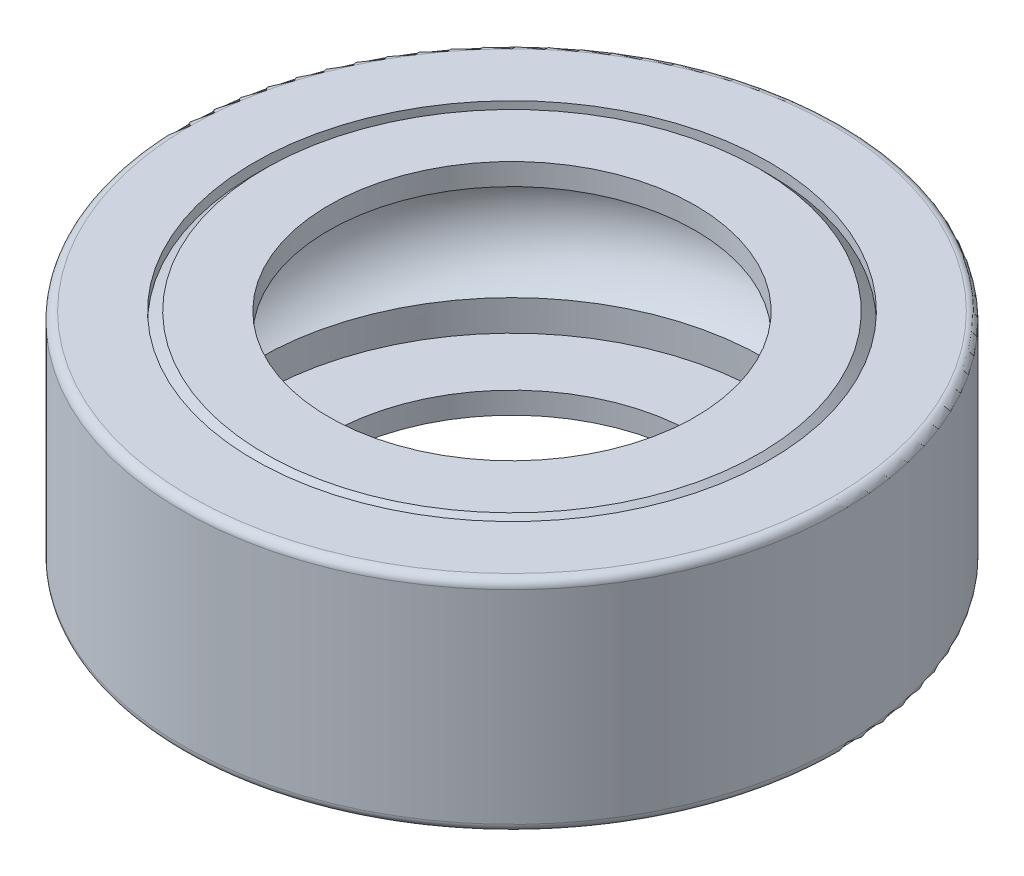
ISO-10303-21;
HEADER;
FILE_DESCRIPTION(('STEP AP214'),'2;1');
FILE_NAME('part.step','',(''),(''),'','','');
FILE_SCHEMA(('AUTOMOTIVE_DESIGN { 1 0 10303 214 1 1 1 1 }'));
ENDSEC;
DATA;
#1=APPLICATION_CONTEXT('core data for automotive mechanical design processes');
#2=APPLICATION_PROTOCOL_DEFINITION('international standard','automotive_design',2000,#1);
#3=PRODUCT_CONTEXT('',#1,'mechanical');
#4=PRODUCT('Part','Part','',(#3));
#5=PRODUCT_RELATED_PRODUCT_CATEGORY('part','',(#4));
#6=PRODUCT_DEFINITION_FORMATION('','',#4);
#7=PRODUCT_DEFINITION_CONTEXT('part definition',#1,'design');
#8=PRODUCT_DEFINITION('design','',#6,#7);
#9=PRODUCT_DEFINITION_SHAPE('','',#8);
#10=(LENGTH_UNIT() NAMED_UNIT(*) SI_UNIT(.MILLI.,.METRE.));
#11=(NAMED_UNIT(*) PLANE_ANGLE_UNIT() SI_UNIT($,.RADIAN.));
#12=(NAMED_UNIT(*) SI_UNIT($,.STERADIAN.) SOLID_ANGLE_UNIT());
#13=UNCERTAINTY_MEASURE_WITH_UNIT(LENGTH_MEASURE(1.E-05),#10,'distance_accuracy_value','');
#14=(GEOMETRIC_REPRESENTATION_CONTEXT(3) GLOBAL_UNCERTAINTY_ASSIGNED_CONTEXT((#13)) GLOBAL_UNIT_ASSIGNED_CONTEXT((#10,
#11,#12)) REPRESENTATION_CONTEXT('',''));
#15=CARTESIAN_POINT('',(0.,0.,0.));
#16=DIRECTION('',(0.,0.,1.));
#17=DIRECTION('',(1.,0.,0.));
#18=AXIS2_PLACEMENT_3D('',#15,#16,#17);
#19=CARTESIAN_POINT('',(0.,-4.,0.));
#20=DIRECTION('',(0.,1.,0.));
#21=DIRECTION('',(0.,0.,1.));
#22=AXIS2_PLACEMENT_3D('',#19,#20,#21);
#23=CYLINDRICAL_SURFACE('',#22,12.);
#24=CARTESIAN_POINT('',(0.,-7.7,0.));
#25=DIRECTION('',(0.,1.,0.));
#26=DIRECTION('',(0.,0.,1.));
#27=AXIS2_PLACEMENT_3D('',#24,#25,#26);
#28=CIRCLE('',#27,12.);
#29=CARTESIAN_POINT('',(0.,-7.7,-12.));
#30=VERTEX_POINT('',#29);
#31=EDGE_CURVE('E10',#30,#30,#28,.T.);
#32=ORIENTED_EDGE('',*,*,#31,.T.);
#33=EDGE_LOOP('',(#32));
#34=FACE_BOUND('',#33,.T.);
#35=CARTESIAN_POINT('',(0.,-0.3,0.));
#36=DIRECTION('',(0.,1.,0.));
#37=DIRECTION('',(0.,0.,1.));
#38=AXIS2_PLACEMENT_3D('',#35,#36,#37);
#39=CIRCLE('',#38,12.);
#40=CARTESIAN_POINT('',(0.,-0.3,-12.));
#41=VERTEX_POINT('',#40);
#42=EDGE_CURVE('E47',#41,#41,#39,.T.);
#43=ORIENTED_EDGE('',*,*,#42,.F.);
#44=EDGE_LOOP('',(#43));
#45=FACE_BOUND('',#44,.T.);
#46=ADVANCED_FACE('F16',(#34,#45),#23,.T.);
#47=CARTESIAN_POINT('',(0.,-7.7,0.));
#48=DIRECTION('',(0.,1.,0.));
#49=DIRECTION('',(0.,0.,1.));
#50=AXIS2_PLACEMENT_3D('',#47,#48,#49);
#51=TOROIDAL_SURFACE('',#50,11.7,0.3);
#52=CARTESIAN_POINT('',(0.,-8.,0.));
#53=DIRECTION('',(0.,1.,0.));
#54=DIRECTION('',(0.,0.,1.));
#55=AXIS2_PLACEMENT_3D('',#52,#53,#54);
#56=CIRCLE('',#55,11.7);
#57=CARTESIAN_POINT('',(0.,-8.,-11.7));
#58=VERTEX_POINT('',#57);
#59=EDGE_CURVE('E26',#58,#58,#56,.T.);
#60=ORIENTED_EDGE('',*,*,#59,.T.);
#61=EDGE_LOOP('',(#60));
#62=FACE_BOUND('',#61,.T.);
#63=ORIENTED_EDGE('',*,*,#31,.F.);
#64=EDGE_LOOP('',(#63));
#65=FACE_BOUND('',#64,.T.);
#66=ADVANCED_FACE('F233',(#62,#65),#51,.T.);
#67=CARTESIAN_POINT('',(0.,-0.3,0.));
#68=DIRECTION('',(0.,1.,0.));
#69=DIRECTION('',(0.,0.,1.));
#70=AXIS2_PLACEMENT_3D('',#67,#68,#69);
#71=TOROIDAL_SURFACE('',#70,11.7,0.3);
#72=ORIENTED_EDGE('',*,*,#42,.T.);
#73=EDGE_LOOP('',(#72));
#74=FACE_BOUND('',#73,.T.);
#75=CARTESIAN_POINT('',(0.,0.,0.));
#76=DIRECTION('',(0.,1.,0.));
#77=DIRECTION('',(0.,0.,1.));
#78=AXIS2_PLACEMENT_3D('',#75,#76,#77);
#79=CIRCLE('',#78,11.7);
#80=CARTESIAN_POINT('',(0.,0.,-11.7));
#81=VERTEX_POINT('',#80);
#82=EDGE_CURVE('E148',#81,#81,#79,.T.);
#83=ORIENTED_EDGE('',*,*,#82,.F.);
#84=EDGE_LOOP('',(#83));
#85=FACE_BOUND('',#84,.T.);
#86=ADVANCED_FACE('F239',(#74,#85),#71,.T.);
#87=CARTESIAN_POINT('',(0.,-8.,10.542));
#88=DIRECTION('',(0.,-1.,0.));
#89=DIRECTION('',(-1.,0.,0.));
#90=AXIS2_PLACEMENT_3D('',#87,#88,#89);
#91=PLANE('',#90);
#92=ORIENTED_EDGE('',*,*,#59,.F.);
#93=EDGE_LOOP('',(#92));
#94=FACE_BOUND('',#93,.T.);
#95=CARTESIAN_POINT('',(0.,-8.,0.));
#96=DIRECTION('',(0.,1.,0.));
#97=DIRECTION('',(0.,0.,1.));
#98=AXIS2_PLACEMENT_3D('',#95,#96,#97);
#99=CIRCLE('',#98,9.384);
#100=CARTESIAN_POINT('',(0.,-8.,-9.384));
#101=VERTEX_POINT('',#100);
#102=EDGE_CURVE('E152',#101,#101,#99,.T.);
#103=ORIENTED_EDGE('',*,*,#102,.T.);
#104=EDGE_LOOP('',(#103));
#105=FACE_BOUND('',#104,.T.);
#106=ADVANCED_FACE('F248',(#94,#105),#91,.T.);
#107=CARTESIAN_POINT('',(0.,0.,10.542));
#108=DIRECTION('',(0.,1.,0.));
#109=DIRECTION('',(1.,0.,0.));
#110=AXIS2_PLACEMENT_3D('',#107,#108,#109);
#111=PLANE('',#110);
#112=CARTESIAN_POINT('',(0.,0.,0.));
#113=DIRECTION('',(0.,1.,0.));
#114=DIRECTION('',(0.,0.,1.));
#115=AXIS2_PLACEMENT_3D('',#112,#113,#114);
#116=CIRCLE('',#115,9.384);
#117=CARTESIAN_POINT('',(0.,0.,-9.384));
#118=VERTEX_POINT('',#117);
#119=EDGE_CURVE('E153',#118,#118,#116,.T.);
#120=ORIENTED_EDGE('',*,*,#119,.F.);
#121=EDGE_LOOP('',(#120));
#122=FACE_BOUND('',#121,.T.);
#123=ORIENTED_EDGE('',*,*,#82,.T.);
#124=EDGE_LOOP('',(#123));
#125=FACE_BOUND('',#124,.T.);
#126=ADVANCED_FACE('F251',(#122,#125),#111,.T.);
#127=CARTESIAN_POINT('',(0.,-7.6,0.));
#128=DIRECTION('',(0.,1.,0.));
#129=DIRECTION('',(0.,0.,1.));
#130=AXIS2_PLACEMENT_3D('',#127,#128,#129);
#131=CYLINDRICAL_SURFACE('',#130,9.384);
#132=ORIENTED_EDGE('',*,*,#102,.F.);
#133=EDGE_LOOP('',(#132));
#134=FACE_BOUND('',#133,.T.);
#135=CARTESIAN_POINT('',(0.,-7.61,0.));
#136=DIRECTION('',(0.,-1.,0.));
#137=DIRECTION('',(0.,0.,1.));
#138=AXIS2_PLACEMENT_3D('',#135,#136,#137);
#139=CIRCLE('',#138,9.384);
#140=CARTESIAN_POINT('',(0.,-7.61,-9.384));
#141=VERTEX_POINT('',#140);
#142=EDGE_CURVE('E173',#141,#141,#139,.T.);
#143=ORIENTED_EDGE('',*,*,#142,.F.);
#144=EDGE_LOOP('',(#143));
#145=FACE_BOUND('',#144,.T.);
#146=ADVANCED_FACE('F255',(#134,#145),#131,.F.);
#147=CARTESIAN_POINT('',(0.,-0.4,0.));
#148=DIRECTION('',(0.,1.,0.));
#149=DIRECTION('',(0.,0.,1.));
#150=AXIS2_PLACEMENT_3D('',#147,#148,#149);
#151=CYLINDRICAL_SURFACE('',#150,9.384);
#152=ORIENTED_EDGE('',*,*,#119,.T.);
#153=EDGE_LOOP('',(#152));
#154=FACE_BOUND('',#153,.T.);
#155=CARTESIAN_POINT('',(0.,-0.39,0.));
#156=DIRECTION('',(0.,1.,0.));
#157=DIRECTION('',(0.,0.,1.));
#158=AXIS2_PLACEMENT_3D('',#155,#156,#157);
#159=CIRCLE('',#158,9.384);
#160=CARTESIAN_POINT('',(0.,-0.39,-9.384));
#161=VERTEX_POINT('',#160);
#162=EDGE_CURVE('E171',#161,#161,#159,.T.);
#163=ORIENTED_EDGE('',*,*,#162,.F.);
#164=EDGE_LOOP('',(#163));
#165=FACE_BOUND('',#164,.T.);
#166=ADVANCED_FACE('F280',(#154,#165),#151,.F.);
#167=CARTESIAN_POINT('',(0.,-7.805,0.));
#168=DIRECTION('',(0.,1.,0.));
#169=DIRECTION('',(0.,0.,1.));
#170=AXIS2_PLACEMENT_3D('',#167,#168,#169);
#171=CONICAL_SURFACE('',#170,9.189,0.785398163397449);
#172=ORIENTED_EDGE('',*,*,#142,.T.);
#173=EDGE_LOOP('',(#172));
#174=FACE_BOUND('',#173,.T.);
#175=CARTESIAN_POINT('',(0.,-8.,0.));
#176=DIRECTION('',(0.,-1.,0.));
#177=DIRECTION('',(0.,0.,1.));
#178=AXIS2_PLACEMENT_3D('',#175,#176,#177);
#179=CIRCLE('',#178,8.994);
#180=CARTESIAN_POINT('',(0.,-8.,-8.994));
#181=VERTEX_POINT('',#180);
#182=EDGE_CURVE('E167',#181,#181,#179,.T.);
#183=ORIENTED_EDGE('',*,*,#182,.F.);
#184=EDGE_LOOP('',(#183));
#185=FACE_BOUND('',#184,.T.);
#186=ADVANCED_FACE('F246',(#174,#185),#171,.T.);
#187=CARTESIAN_POINT('',(0.,-0.195,0.));
#188=DIRECTION('',(0.,-1.,0.));
#189=DIRECTION('',(0.,0.,1.));
#190=AXIS2_PLACEMENT_3D('',#187,#188,#189);
#191=CONICAL_SURFACE('',#190,9.189,0.785398163397449);
#192=ORIENTED_EDGE('',*,*,#162,.T.);
#193=EDGE_LOOP('',(#192));
#194=FACE_BOUND('',#193,.T.);
#195=CARTESIAN_POINT('',(0.,0.,0.));
#196=DIRECTION('',(0.,1.,0.));
#197=DIRECTION('',(0.,0.,1.));
#198=AXIS2_PLACEMENT_3D('',#195,#196,#197);
#199=CIRCLE('',#198,8.994);
#200=CARTESIAN_POINT('',(0.,0.,-8.994));
#201=VERTEX_POINT('',#200);
#202=EDGE_CURVE('E172',#201,#201,#199,.T.);
#203=ORIENTED_EDGE('',*,*,#202,.F.);
#204=EDGE_LOOP('',(#203));
#205=FACE_BOUND('',#204,.T.);
#206=ADVANCED_FACE('F227',(#194,#205),#191,.T.);
#207=CARTESIAN_POINT('',(0.,-8.,7.834));
#208=DIRECTION('',(0.,-1.,0.));
#209=DIRECTION('',(-1.,0.,0.));
#210=AXIS2_PLACEMENT_3D('',#207,#208,#209);
#211=PLANE('',#210);
#212=CARTESIAN_POINT('',(0.,-8.,0.));
#213=DIRECTION('',(0.,-1.,0.));
#214=DIRECTION('',(0.,0.,1.));
#215=AXIS2_PLACEMENT_3D('',#212,#213,#214);
#216=CIRCLE('',#215,6.674);
#217=CARTESIAN_POINT('',(0.,-8.,-6.674));
#218=VERTEX_POINT('',#217);
#219=EDGE_CURVE('E20',#218,#218,#216,.T.);
#220=ORIENTED_EDGE('',*,*,#219,.F.);
#221=EDGE_LOOP('',(#220));
#222=FACE_BOUND('',#221,.T.);
#223=ORIENTED_EDGE('',*,*,#182,.T.);
#224=EDGE_LOOP('',(#223));
#225=FACE_BOUND('',#224,.T.);
#226=ADVANCED_FACE('F219',(#222,#225),#211,.T.);
#227=CARTESIAN_POINT('',(0.,0.,7.834));
#228=DIRECTION('',(0.,1.,0.));
#229=DIRECTION('',(1.,0.,0.));
#230=AXIS2_PLACEMENT_3D('',#227,#228,#229);
#231=PLANE('',#230);
#232=CARTESIAN_POINT('',(0.,0.,0.));
#233=DIRECTION('',(0.,1.,0.));
#234=DIRECTION('',(0.,0.,1.));
#235=AXIS2_PLACEMENT_3D('',#232,#233,#234);
#236=CIRCLE('',#235,6.674);
#237=CARTESIAN_POINT('',(0.,0.,-6.674));
#238=VERTEX_POINT('',#237);
#239=EDGE_CURVE('E136',#238,#238,#236,.T.);
#240=ORIENTED_EDGE('',*,*,#239,.F.);
#241=EDGE_LOOP('',(#240));
#242=FACE_BOUND('',#241,.T.);
#243=ORIENTED_EDGE('',*,*,#202,.T.);
#244=EDGE_LOOP('',(#243));
#245=FACE_BOUND('',#244,.T.);
#246=ADVANCED_FACE('F216',(#242,#245),#231,.T.);
#247=CARTESIAN_POINT('',(0.,-7.605,0.));
#248=DIRECTION('',(0.,-1.,0.));
#249=DIRECTION('',(0.,0.,1.));
#250=AXIS2_PLACEMENT_3D('',#247,#248,#249);
#251=CYLINDRICAL_SURFACE('',#250,6.674);
#252=ORIENTED_EDGE('',*,*,#219,.T.);
#253=EDGE_LOOP('',(#252));
#254=FACE_BOUND('',#253,.T.);
#255=CARTESIAN_POINT('',(0.,-7.21,0.));
#256=DIRECTION('',(0.,-1.,0.));
#257=DIRECTION('',(0.,0.,1.));
#258=AXIS2_PLACEMENT_3D('',#255,#256,#257);
#259=CIRCLE('',#258,6.674);
#260=CARTESIAN_POINT('',(0.,-7.21,-6.674));
#261=VERTEX_POINT('',#260);
#262=EDGE_CURVE('E118',#261,#261,#259,.T.);
#263=ORIENTED_EDGE('',*,*,#262,.F.);
#264=EDGE_LOOP('',(#263));
#265=FACE_BOUND('',#264,.T.);
#266=ADVANCED_FACE('F218',(#254,#265),#251,.F.);
#267=CARTESIAN_POINT('',(0.,-0.395,0.));
#268=DIRECTION('',(0.,1.,0.));
#269=DIRECTION('',(0.,0.,1.));
#270=AXIS2_PLACEMENT_3D('',#267,#268,#269);
#271=CYLINDRICAL_SURFACE('',#270,6.674);
#272=ORIENTED_EDGE('',*,*,#239,.T.);
#273=EDGE_LOOP('',(#272));
#274=FACE_BOUND('',#273,.T.);
#275=CARTESIAN_POINT('',(0.,-0.79,0.));
#276=DIRECTION('',(0.,1.,0.));
#277=DIRECTION('',(0.,0.,1.));
#278=AXIS2_PLACEMENT_3D('',#275,#276,#277);
#279=CIRCLE('',#278,6.674);
#280=CARTESIAN_POINT('',(0.,-0.79,-6.674));
#281=VERTEX_POINT('',#280);
#282=EDGE_CURVE('E125',#281,#281,#279,.T.);
#283=ORIENTED_EDGE('',*,*,#282,.F.);
#284=EDGE_LOOP('',(#283));
#285=FACE_BOUND('',#284,.T.);
#286=ADVANCED_FACE('F126',(#274,#285),#271,.F.);
#287=CARTESIAN_POINT('',(0.,-7.21,8.029));
#288=DIRECTION('',(0.,1.,0.));
#289=DIRECTION('',(1.,0.,0.));
#290=AXIS2_PLACEMENT_3D('',#287,#288,#289);
#291=PLANE('',#290);
#292=CARTESIAN_POINT('',(0.,-7.21,0.));
#293=DIRECTION('',(0.,-1.,0.));
#294=DIRECTION('',(0.,0.,1.));
#295=AXIS2_PLACEMENT_3D('',#292,#293,#294);
#296=CIRCLE('',#295,9.384);
#297=CARTESIAN_POINT('',(0.,-7.21,-9.384));
#298=VERTEX_POINT('',#297);
#299=EDGE_CURVE('E140',#298,#298,#296,.T.);
#300=ORIENTED_EDGE('',*,*,#299,.F.);
#301=EDGE_LOOP('',(#300));
#302=FACE_BOUND('',#301,.T.);
#303=ORIENTED_EDGE('',*,*,#262,.T.);
#304=EDGE_LOOP('',(#303));
#305=FACE_BOUND('',#304,.T.);
#306=ADVANCED_FACE('F243',(#302,#305),#291,.T.);
#307=CARTESIAN_POINT('',(0.,-0.79,8.029));
#308=DIRECTION('',(0.,-1.,0.));
#309=DIRECTION('',(-1.,0.,0.));
#310=AXIS2_PLACEMENT_3D('',#307,#308,#309);
#311=PLANE('',#310);
#312=CARTESIAN_POINT('',(0.,-0.79,0.));
#313=DIRECTION('',(0.,1.,0.));
#314=DIRECTION('',(0.,0.,1.));
#315=AXIS2_PLACEMENT_3D('',#312,#313,#314);
#316=CIRCLE('',#315,9.384);
#317=CARTESIAN_POINT('',(0.,-0.79,-9.384));
#318=VERTEX_POINT('',#317);
#319=EDGE_CURVE('E147',#318,#318,#316,.T.);
#320=ORIENTED_EDGE('',*,*,#319,.F.);
#321=EDGE_LOOP('',(#320));
#322=FACE_BOUND('',#321,.T.);
#323=ORIENTED_EDGE('',*,*,#282,.T.);
#324=EDGE_LOOP('',(#323));
#325=FACE_BOUND('',#324,.T.);
#326=ADVANCED_FACE('F18',(#322,#325),#311,.T.);
#327=CARTESIAN_POINT('',(0.,-7.6,0.));
#328=DIRECTION('',(0.,1.,0.));
#329=DIRECTION('',(0.,0.,1.));
#330=AXIS2_PLACEMENT_3D('',#327,#328,#329);
#331=CYLINDRICAL_SURFACE('',#330,9.384);
#332=CARTESIAN_POINT('',(0.,-7.2,0.));
#333=DIRECTION('',(0.,1.,0.));
#334=DIRECTION('',(0.,0.,1.));
#335=AXIS2_PLACEMENT_3D('',#332,#333,#334);
#336=CIRCLE('',#335,9.384);
#337=CARTESIAN_POINT('',(0.,-7.2,-9.384));
#338=VERTEX_POINT('',#337);
#339=EDGE_CURVE('E129',#338,#338,#336,.T.);
#340=ORIENTED_EDGE('',*,*,#339,.T.);
#341=EDGE_LOOP('',(#340));
#342=FACE_BOUND('',#341,.T.);
#343=ORIENTED_EDGE('',*,*,#299,.T.);
#344=EDGE_LOOP('',(#343));
#345=FACE_BOUND('',#344,.T.);
#346=ADVANCED_FACE('F267',(#342,#345),#331,.F.);
#347=CARTESIAN_POINT('',(0.,-4.,0.));
#348=DIRECTION('',(0.,1.,0.));
#349=DIRECTION('',(0.,0.,1.));
#350=AXIS2_PLACEMENT_3D('',#347,#348,#349);
#351=TOROIDAL_SURFACE('',#350,8.,2.4);
#352=CARTESIAN_POINT('',(0.,-1.92153903091735,0.));
#353=DIRECTION('',(0.,1.,0.));
#354=DIRECTION('',(0.,0.,1.));
#355=AXIS2_PLACEMENT_3D('',#352,#353,#354);
#356=CIRCLE('',#355,9.2);
#357=CARTESIAN_POINT('',(6.50538238691624,-1.92153903091735,6.50538238691624));
#358=VERTEX_POINT('',#357);
#359=EDGE_CURVE('E144',#358,#358,#356,.T.);
#360=ORIENTED_EDGE('',*,*,#359,.T.);
#361=EDGE_LOOP('',(#360));
#362=FACE_BOUND('',#361,.T.);
#363=CARTESIAN_POINT('',(0.,-6.07846096908265,0.));
#364=DIRECTION('',(0.,1.,0.));
#365=DIRECTION('',(0.,0.,1.));
#366=AXIS2_PLACEMENT_3D('',#363,#364,#365);
#367=CIRCLE('',#366,9.2);
#368=CARTESIAN_POINT('',(6.50538238691623,-6.07846096908266,6.50538238691623));
#369=VERTEX_POINT('',#368);
#370=EDGE_CURVE('E166',#369,#369,#367,.T.);
#371=ORIENTED_EDGE('',*,*,#370,.F.);
#372=EDGE_LOOP('',(#371));
#373=FACE_BOUND('',#372,.T.);
#374=ADVANCED_FACE('F263',(#362,#373),#351,.F.);
#375=CARTESIAN_POINT('',(0.,-0.4,0.));
#376=DIRECTION('',(0.,1.,0.));
#377=DIRECTION('',(0.,0.,1.));
#378=AXIS2_PLACEMENT_3D('',#375,#376,#377);
#379=CYLINDRICAL_SURFACE('',#378,9.384);
#380=ORIENTED_EDGE('',*,*,#319,.T.);
#381=EDGE_LOOP('',(#380));
#382=FACE_BOUND('',#381,.T.);
#383=CARTESIAN_POINT('',(0.,-0.8,0.));
#384=DIRECTION('',(0.,1.,0.));
#385=DIRECTION('',(0.,0.,1.));
#386=AXIS2_PLACEMENT_3D('',#383,#384,#385);
#387=CIRCLE('',#386,9.384);
#388=CARTESIAN_POINT('',(0.,-0.8,-9.384));
#389=VERTEX_POINT('',#388);
#390=EDGE_CURVE('E158',#389,#389,#387,.T.);
#391=ORIENTED_EDGE('',*,*,#390,.F.);
#392=EDGE_LOOP('',(#391));
#393=FACE_BOUND('',#392,.T.);
#394=ADVANCED_FACE('F259',(#382,#393),#379,.F.);
#395=CARTESIAN_POINT('',(0.,-7.2,9.292));
#396=DIRECTION('',(0.,-1.,0.));
#397=DIRECTION('',(-1.,0.,0.));
#398=AXIS2_PLACEMENT_3D('',#395,#396,#397);
#399=PLANE('',#398);
#400=ORIENTED_EDGE('',*,*,#339,.F.);
#401=EDGE_LOOP('',(#400));
#402=FACE_BOUND('',#401,.T.);
#403=CARTESIAN_POINT('',(0.,-7.2,0.));
#404=DIRECTION('',(0.,1.,0.));
#405=DIRECTION('',(0.,0.,1.));
#406=AXIS2_PLACEMENT_3D('',#403,#404,#405);
#407=CIRCLE('',#406,9.2);
#408=CARTESIAN_POINT('',(0.,-7.2,-9.2));
#409=VERTEX_POINT('',#408);
#410=EDGE_CURVE('E162',#409,#409,#407,.T.);
#411=ORIENTED_EDGE('',*,*,#410,.T.);
#412=EDGE_LOOP('',(#411));
#413=FACE_BOUND('',#412,.T.);
#414=ADVANCED_FACE('F262',(#402,#413),#399,.T.);
#415=CARTESIAN_POINT('',(0.,-6.63923048454133,0.));
#416=DIRECTION('',(0.,1.,0.));
#417=DIRECTION('',(0.,0.,1.));
#418=AXIS2_PLACEMENT_3D('',#415,#416,#417);
#419=CYLINDRICAL_SURFACE('',#418,9.2);
#420=ORIENTED_EDGE('',*,*,#370,.T.);
#421=EDGE_LOOP('',(#420));
#422=FACE_BOUND('',#421,.T.);
#423=ORIENTED_EDGE('',*,*,#410,.F.);
#424=EDGE_LOOP('',(#423));
#425=FACE_BOUND('',#424,.T.);
#426=ADVANCED_FACE('F274',(#422,#425),#419,.F.);
#427=CARTESIAN_POINT('',(0.,-0.8,9.292));
#428=DIRECTION('',(0.,1.,0.));
#429=DIRECTION('',(1.,0.,0.));
#430=AXIS2_PLACEMENT_3D('',#427,#428,#429);
#431=PLANE('',#430);
#432=CARTESIAN_POINT('',(0.,-0.8,0.));
#433=DIRECTION('',(0.,1.,0.));
#434=DIRECTION('',(0.,0.,1.));
#435=AXIS2_PLACEMENT_3D('',#432,#433,#434);
#436=CIRCLE('',#435,9.2);
#437=CARTESIAN_POINT('',(0.,-0.8,-9.2));
#438=VERTEX_POINT('',#437);
#439=EDGE_CURVE('E154',#438,#438,#436,.T.);
#440=ORIENTED_EDGE('',*,*,#439,.F.);
#441=EDGE_LOOP('',(#440));
#442=FACE_BOUND('',#441,.T.);
#443=ORIENTED_EDGE('',*,*,#390,.T.);
#444=EDGE_LOOP('',(#443));
#445=FACE_BOUND('',#444,.T.);
#446=ADVANCED_FACE('F272',(#442,#445),#431,.T.);
#447=CARTESIAN_POINT('',(0.,-1.36076951545868,0.));
#448=DIRECTION('',(0.,1.,0.));
#449=DIRECTION('',(0.,0.,1.));
#450=AXIS2_PLACEMENT_3D('',#447,#448,#449);
#451=CYLINDRICAL_SURFACE('',#450,9.2);
#452=ORIENTED_EDGE('',*,*,#439,.T.);
#453=EDGE_LOOP('',(#452));
#454=FACE_BOUND('',#453,.T.);
#455=ORIENTED_EDGE('',*,*,#359,.F.);
#456=EDGE_LOOP('',(#455));
#457=FACE_BOUND('',#456,.T.);
#458=ADVANCED_FACE('F269',(#454,#457),#451,.F.);
#459=CLOSED_SHELL('',(#46,#66,#86,#106,#126,#146,#166,#186,#206,#226,#246,#266,#286,#306,#326,
#346,#374,#394,#414,#426,#446,#458));
#460=MANIFOLD_SOLID_BREP('B1',#459);
#461=ADVANCED_BREP_SHAPE_REPRESENTATION('',(#18,#460),#14);
#462=SHAPE_DEFINITION_REPRESENTATION(#9,#461);
ENDSEC;
END-ISO-10303-21;
